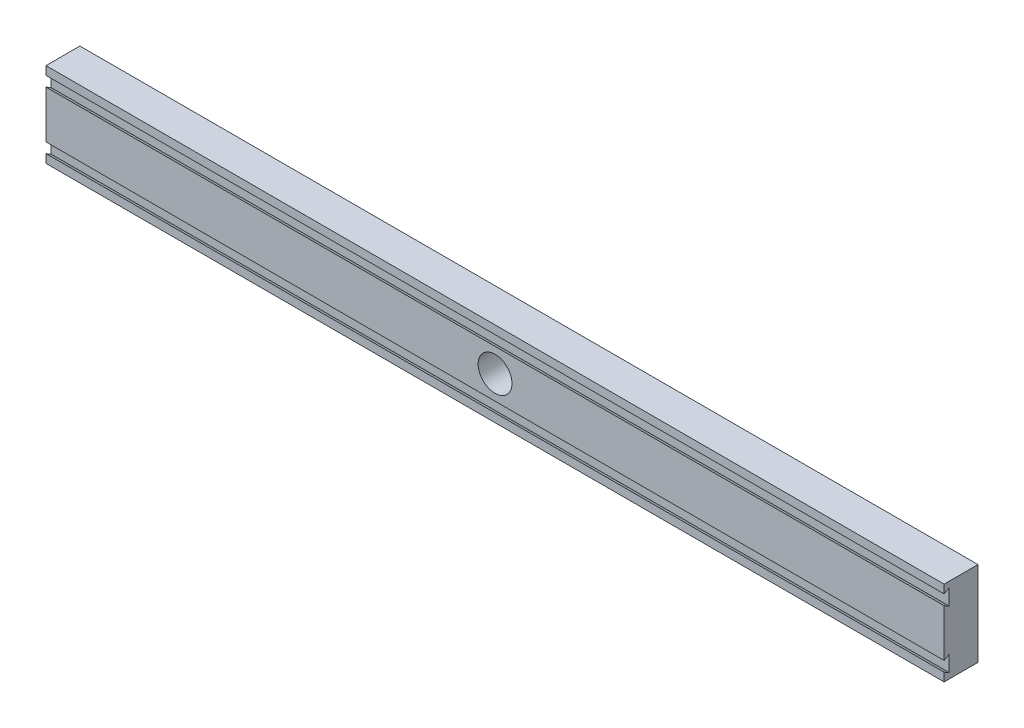
ISO-10303-21;
HEADER;
FILE_DESCRIPTION(('STEP AP214'),'2;1');
FILE_NAME('part.step','',(''),(''),'','','');
FILE_SCHEMA(('AUTOMOTIVE_DESIGN { 1 0 10303 214 1 1 1 1 }'));
ENDSEC;
DATA;
#1=APPLICATION_CONTEXT('core data for automotive mechanical design processes');
#2=APPLICATION_PROTOCOL_DEFINITION('international standard','automotive_design',2000,#1);
#3=PRODUCT_CONTEXT('',#1,'mechanical');
#4=PRODUCT('Part','Part','',(#3));
#5=PRODUCT_RELATED_PRODUCT_CATEGORY('part','',(#4));
#6=PRODUCT_DEFINITION_FORMATION('','',#4);
#7=PRODUCT_DEFINITION_CONTEXT('part definition',#1,'design');
#8=PRODUCT_DEFINITION('design','',#6,#7);
#9=PRODUCT_DEFINITION_SHAPE('','',#8);
#10=(LENGTH_UNIT() NAMED_UNIT(*) SI_UNIT(.MILLI.,.METRE.));
#11=(NAMED_UNIT(*) PLANE_ANGLE_UNIT() SI_UNIT($,.RADIAN.));
#12=(NAMED_UNIT(*) SI_UNIT($,.STERADIAN.) SOLID_ANGLE_UNIT());
#13=UNCERTAINTY_MEASURE_WITH_UNIT(LENGTH_MEASURE(1.E-05),#10,'distance_accuracy_value','');
#14=(GEOMETRIC_REPRESENTATION_CONTEXT(3) GLOBAL_UNCERTAINTY_ASSIGNED_CONTEXT((#13)) GLOBAL_UNIT_ASSIGNED_CONTEXT((#10,
#11,#12)) REPRESENTATION_CONTEXT('',''));
#15=CARTESIAN_POINT('',(0.,0.,0.));
#16=DIRECTION('',(0.,0.,1.));
#17=DIRECTION('',(1.,0.,0.));
#18=AXIS2_PLACEMENT_3D('',#15,#16,#17);
#19=CARTESIAN_POINT('',(53.106,-3.873757454592,1.90611488033737));
#20=DIRECTION('',(0.,0.866025403784436,-0.500000000000004));
#21=DIRECTION('',(0.,0.500000000000004,0.866025403784436));
#22=AXIS2_PLACEMENT_3D('',#19,#20,#21);
#23=PLANE('',#22);
#24=DIRECTION('',(0.,-0.500000000000005,-0.866025403784436));
#25=VECTOR('',#24,1.);
#26=CARTESIAN_POINT('',(-53.106,-3.873757454592,1.90611488033737));
#27=LINE('',#26,#25);
#28=CARTESIAN_POINT('',(-53.106,-4.008,1.67359997115333));
#29=VERTEX_POINT('',#28);
#30=CARTESIAN_POINT('',(-53.106,-4.35510298183681,1.07239997115333));
#31=VERTEX_POINT('',#30);
#32=EDGE_CURVE('E169',#29,#31,#27,.T.);
#33=ORIENTED_EDGE('',*,*,#32,.F.);
#34=DIRECTION('',(-1.,0.,0.));
#35=VECTOR('',#34,1.);
#36=CARTESIAN_POINT('',(53.106,-4.008,1.67359997115333));
#37=LINE('',#36,#35);
#38=CARTESIAN_POINT('',(53.106,-4.008,1.67359997115333));
#39=VERTEX_POINT('',#38);
#40=EDGE_CURVE('E11',#39,#29,#37,.T.);
#41=ORIENTED_EDGE('',*,*,#40,.F.);
#42=DIRECTION('',(0.,-0.500000000000005,-0.866025403784436));
#43=VECTOR('',#42,1.);
#44=CARTESIAN_POINT('',(53.106,-3.873757454592,1.90611488033737));
#45=LINE('',#44,#43);
#46=CARTESIAN_POINT('',(53.106,-4.35510298183681,1.07239997115333));
#47=VERTEX_POINT('',#46);
#48=EDGE_CURVE('E206',#39,#47,#45,.T.);
#49=ORIENTED_EDGE('',*,*,#48,.T.);
#50=DIRECTION('',(-1.,0.,0.));
#51=VECTOR('',#50,1.);
#52=CARTESIAN_POINT('',(53.106,-4.35510298183681,1.07239997115333));
#53=LINE('',#52,#51);
#54=EDGE_CURVE('E62',#47,#31,#53,.T.);
#55=ORIENTED_EDGE('',*,*,#54,.T.);
#56=EDGE_LOOP('',(#33,#41,#49,#55));
#57=FACE_BOUND('',#56,.T.);
#58=ADVANCED_FACE('F45',(#57),#23,.T.);
#59=CARTESIAN_POINT('',(53.106,0.,1.67359997115333));
#60=DIRECTION('',(0.,0.,1.));
#61=DIRECTION('',(1.,0.,0.));
#62=AXIS2_PLACEMENT_3D('',#59,#60,#61);
#63=PLANE('',#62);
#64=DIRECTION('',(0.,1.,0.));
#65=VECTOR('',#64,1.);
#66=CARTESIAN_POINT('',(-53.106,0.,1.67359997115333));
#67=LINE('',#66,#65);
#68=CARTESIAN_POINT('',(-53.106,-5.01,1.67359997115333));
#69=VERTEX_POINT('',#68);
#70=EDGE_CURVE('E172',#69,#29,#67,.T.);
#71=ORIENTED_EDGE('',*,*,#70,.F.);
#72=DIRECTION('',(-1.,0.,0.));
#73=VECTOR('',#72,1.);
#74=CARTESIAN_POINT('',(53.106,-5.01,1.67359997115333));
#75=LINE('',#74,#73);
#76=CARTESIAN_POINT('',(53.106,-5.01,1.67359997115333));
#77=VERTEX_POINT('',#76);
#78=EDGE_CURVE('E54',#77,#69,#75,.T.);
#79=ORIENTED_EDGE('',*,*,#78,.F.);
#80=DIRECTION('',(0.,1.,0.));
#81=VECTOR('',#80,1.);
#82=CARTESIAN_POINT('',(53.106,0.,1.67359997115333));
#83=LINE('',#82,#81);
#84=EDGE_CURVE('E159',#77,#39,#83,.T.);
#85=ORIENTED_EDGE('',*,*,#84,.T.);
#86=ORIENTED_EDGE('',*,*,#40,.T.);
#87=EDGE_LOOP('',(#71,#79,#85,#86));
#88=FACE_BOUND('',#87,.T.);
#89=ADVANCED_FACE('F247',(#88),#63,.T.);
#90=CARTESIAN_POINT('',(53.106,-5.01,-0.33040002884667));
#91=DIRECTION('',(0.,1.,0.));
#92=DIRECTION('',(0.,0.,1.));
#93=AXIS2_PLACEMENT_3D('',#90,#91,#92);
#94=PLANE('',#93);
#95=DIRECTION('',(0.,0.,-1.));
#96=VECTOR('',#95,1.);
#97=CARTESIAN_POINT('',(-53.106,-5.01,-0.33040002884667));
#98=LINE('',#97,#96);
#99=CARTESIAN_POINT('',(-53.106,-5.01,-2.33440002884667));
#100=VERTEX_POINT('',#99);
#101=EDGE_CURVE('E177',#69,#100,#98,.T.);
#102=ORIENTED_EDGE('',*,*,#101,.T.);
#103=DIRECTION('',(-1.,0.,0.));
#104=VECTOR('',#103,1.);
#105=CARTESIAN_POINT('',(53.106,-5.01,-2.33440002884667));
#106=LINE('',#105,#104);
#107=CARTESIAN_POINT('',(53.106,-5.01,-2.33440002884667));
#108=VERTEX_POINT('',#107);
#109=EDGE_CURVE('E230',#108,#100,#106,.T.);
#110=ORIENTED_EDGE('',*,*,#109,.F.);
#111=DIRECTION('',(0.,0.,-1.));
#112=VECTOR('',#111,1.);
#113=CARTESIAN_POINT('',(53.106,-5.01,-0.33040002884667));
#114=LINE('',#113,#112);
#115=EDGE_CURVE('E239',#77,#108,#114,.T.);
#116=ORIENTED_EDGE('',*,*,#115,.F.);
#117=ORIENTED_EDGE('',*,*,#78,.T.);
#118=EDGE_LOOP('',(#102,#110,#116,#117));
#119=FACE_BOUND('',#118,.T.);
#120=ADVANCED_FACE('F237',(#119),#94,.F.);
#121=CARTESIAN_POINT('',(53.106,0.,-2.33440002884667));
#122=DIRECTION('',(0.,0.,1.));
#123=DIRECTION('',(1.,0.,0.));
#124=AXIS2_PLACEMENT_3D('',#121,#122,#123);
#125=PLANE('',#124);
#126=CARTESIAN_POINT('',(0.,0.,-2.33440002884667));
#127=DIRECTION('',(0.,0.,1.));
#128=DIRECTION('',(1.,0.,0.));
#129=AXIS2_PLACEMENT_3D('',#126,#127,#128);
#130=CIRCLE('',#129,2.004);
#131=CARTESIAN_POINT('',(2.00399999999999,0.,-2.33440002884667));
#132=VERTEX_POINT('',#131);
#133=EDGE_CURVE('E173',#132,#132,#130,.T.);
#134=ORIENTED_EDGE('',*,*,#133,.T.);
#135=EDGE_LOOP('',(#134));
#136=FACE_BOUND('',#135,.T.);
#137=DIRECTION('',(0.,1.,0.));
#138=VECTOR('',#137,1.);
#139=CARTESIAN_POINT('',(-53.106,0.,-2.33440002884667));
#140=LINE('',#139,#138);
#141=CARTESIAN_POINT('',(-53.106,5.01,-2.33440002884667));
#142=VERTEX_POINT('',#141);
#143=EDGE_CURVE('E181',#100,#142,#140,.T.);
#144=ORIENTED_EDGE('',*,*,#143,.T.);
#145=DIRECTION('',(-1.,0.,0.));
#146=VECTOR('',#145,1.);
#147=CARTESIAN_POINT('',(53.106,5.01,-2.33440002884667));
#148=LINE('',#147,#146);
#149=CARTESIAN_POINT('',(53.106,5.01,-2.33440002884667));
#150=VERTEX_POINT('',#149);
#151=EDGE_CURVE('E227',#150,#142,#148,.T.);
#152=ORIENTED_EDGE('',*,*,#151,.F.);
#153=DIRECTION('',(0.,1.,0.));
#154=VECTOR('',#153,1.);
#155=CARTESIAN_POINT('',(53.106,0.,-2.33440002884667));
#156=LINE('',#155,#154);
#157=EDGE_CURVE('E296',#108,#150,#156,.T.);
#158=ORIENTED_EDGE('',*,*,#157,.F.);
#159=ORIENTED_EDGE('',*,*,#109,.T.);
#160=EDGE_LOOP('',(#144,#152,#158,#159));
#161=FACE_BOUND('',#160,.T.);
#162=ADVANCED_FACE('F267',(#136,#161),#125,.F.);
#163=CARTESIAN_POINT('',(53.106,5.01,-0.33040002884667));
#164=DIRECTION('',(0.,1.,0.));
#165=DIRECTION('',(0.,0.,1.));
#166=AXIS2_PLACEMENT_3D('',#163,#164,#165);
#167=PLANE('',#166);
#168=DIRECTION('',(0.,0.,-1.));
#169=VECTOR('',#168,1.);
#170=CARTESIAN_POINT('',(-53.106,5.01,-0.33040002884667));
#171=LINE('',#170,#169);
#172=CARTESIAN_POINT('',(-53.106,5.01,1.67359997115333));
#173=VERTEX_POINT('',#172);
#174=EDGE_CURVE('E185',#173,#142,#171,.T.);
#175=ORIENTED_EDGE('',*,*,#174,.F.);
#176=DIRECTION('',(-1.,0.,0.));
#177=VECTOR('',#176,1.);
#178=CARTESIAN_POINT('',(53.106,5.01,1.67359997115333));
#179=LINE('',#178,#177);
#180=CARTESIAN_POINT('',(53.106,5.01,1.67359997115333));
#181=VERTEX_POINT('',#180);
#182=EDGE_CURVE('E224',#181,#173,#179,.T.);
#183=ORIENTED_EDGE('',*,*,#182,.F.);
#184=DIRECTION('',(0.,0.,-1.));
#185=VECTOR('',#184,1.);
#186=CARTESIAN_POINT('',(53.106,5.01,-0.33040002884667));
#187=LINE('',#186,#185);
#188=EDGE_CURVE('E299',#181,#150,#187,.T.);
#189=ORIENTED_EDGE('',*,*,#188,.T.);
#190=ORIENTED_EDGE('',*,*,#151,.T.);
#191=EDGE_LOOP('',(#175,#183,#189,#190));
#192=FACE_BOUND('',#191,.T.);
#193=ADVANCED_FACE('F271',(#192),#167,.T.);
#194=CARTESIAN_POINT('',(-53.106,4.008,1.67359997115333));
#195=VERTEX_POINT('',#194);
#196=EDGE_CURVE('E178',#195,#173,#67,.T.);
#197=ORIENTED_EDGE('',*,*,#196,.F.);
#198=DIRECTION('',(-1.,0.,0.));
#199=VECTOR('',#198,1.);
#200=CARTESIAN_POINT('',(53.106,4.008,1.67359997115333));
#201=LINE('',#200,#199);
#202=CARTESIAN_POINT('',(53.106,4.008,1.67359997115333));
#203=VERTEX_POINT('',#202);
#204=EDGE_CURVE('E221',#203,#195,#201,.T.);
#205=ORIENTED_EDGE('',*,*,#204,.F.);
#206=EDGE_CURVE('E158',#203,#181,#83,.T.);
#207=ORIENTED_EDGE('',*,*,#206,.T.);
#208=ORIENTED_EDGE('',*,*,#182,.T.);
#209=EDGE_LOOP('',(#197,#205,#207,#208));
#210=FACE_BOUND('',#209,.T.);
#211=ADVANCED_FACE('F263',(#210),#63,.T.);
#212=CARTESIAN_POINT('',(53.106,3.873757454592,1.90611488033737));
#213=DIRECTION('',(0.,0.866025403784436,0.500000000000004));
#214=DIRECTION('',(0.,-0.500000000000004,0.866025403784436));
#215=AXIS2_PLACEMENT_3D('',#212,#213,#214);
#216=PLANE('',#215);
#217=DIRECTION('',(0.,0.500000000000005,-0.866025403784436));
#218=VECTOR('',#217,1.);
#219=CARTESIAN_POINT('',(-53.106,3.873757454592,1.90611488033737));
#220=LINE('',#219,#218);
#221=CARTESIAN_POINT('',(-53.106,4.35510298183681,1.07239997115333));
#222=VERTEX_POINT('',#221);
#223=EDGE_CURVE('E189',#195,#222,#220,.T.);
#224=ORIENTED_EDGE('',*,*,#223,.T.);
#225=DIRECTION('',(-1.,0.,0.));
#226=VECTOR('',#225,1.);
#227=CARTESIAN_POINT('',(53.106,4.35510298183681,1.07239997115333));
#228=LINE('',#227,#226);
#229=CARTESIAN_POINT('',(53.106,4.35510298183681,1.07239997115333));
#230=VERTEX_POINT('',#229);
#231=EDGE_CURVE('E217',#230,#222,#228,.T.);
#232=ORIENTED_EDGE('',*,*,#231,.F.);
#233=DIRECTION('',(0.,0.500000000000005,-0.866025403784436));
#234=VECTOR('',#233,1.);
#235=CARTESIAN_POINT('',(53.106,3.873757454592,1.90611488033737));
#236=LINE('',#235,#234);
#237=EDGE_CURVE('E303',#203,#230,#236,.T.);
#238=ORIENTED_EDGE('',*,*,#237,.F.);
#239=ORIENTED_EDGE('',*,*,#204,.T.);
#240=EDGE_LOOP('',(#224,#232,#238,#239));
#241=FACE_BOUND('',#240,.T.);
#242=ADVANCED_FACE('F270',(#241),#216,.F.);
#243=CARTESIAN_POINT('',(53.106,0.,1.07239997115333));
#244=DIRECTION('',(0.,0.,-1.));
#245=DIRECTION('',(-1.,0.,0.));
#246=AXIS2_PLACEMENT_3D('',#243,#244,#245);
#247=PLANE('',#246);
#248=DIRECTION('',(0.,-1.,0.));
#249=VECTOR('',#248,1.);
#250=CARTESIAN_POINT('',(-53.106,0.,1.07239997115333));
#251=LINE('',#250,#249);
#252=CARTESIAN_POINT('',(-53.106,2.45849701816319,1.07239997115333));
#253=VERTEX_POINT('',#252);
#254=EDGE_CURVE('E192',#222,#253,#251,.T.);
#255=ORIENTED_EDGE('',*,*,#254,.T.);
#256=DIRECTION('',(-1.,0.,0.));
#257=VECTOR('',#256,1.);
#258=CARTESIAN_POINT('',(53.106,2.45849701816319,1.07239997115333));
#259=LINE('',#258,#257);
#260=CARTESIAN_POINT('',(53.106,2.45849701816319,1.07239997115333));
#261=VERTEX_POINT('',#260);
#262=EDGE_CURVE('E213',#261,#253,#259,.T.);
#263=ORIENTED_EDGE('',*,*,#262,.F.);
#264=DIRECTION('',(0.,-1.,0.));
#265=VECTOR('',#264,1.);
#266=CARTESIAN_POINT('',(53.106,0.,1.07239997115333));
#267=LINE('',#266,#265);
#268=EDGE_CURVE('E305',#230,#261,#267,.T.);
#269=ORIENTED_EDGE('',*,*,#268,.F.);
#270=ORIENTED_EDGE('',*,*,#231,.T.);
#271=EDGE_LOOP('',(#255,#263,#269,#270));
#272=FACE_BOUND('',#271,.T.);
#273=ADVANCED_FACE('F279',(#272),#247,.F.);
#274=CARTESIAN_POINT('',(53.106,1.23644254540798,-1.04426046527548));
#275=DIRECTION('',(0.,-0.866025403784437,0.500000000000003));
#276=DIRECTION('',(0.,-0.500000000000003,-0.866025403784437));
#277=AXIS2_PLACEMENT_3D('',#274,#275,#276);
#278=PLANE('',#277);
#279=DIRECTION('',(0.,0.500000000000003,0.866025403784437));
#280=VECTOR('',#279,1.);
#281=CARTESIAN_POINT('',(-53.106,1.23644254540798,-1.04426046527548));
#282=LINE('',#281,#280);
#283=CARTESIAN_POINT('',(-53.106,2.8056,1.67359997115333));
#284=VERTEX_POINT('',#283);
#285=EDGE_CURVE('E195',#253,#284,#282,.T.);
#286=ORIENTED_EDGE('',*,*,#285,.T.);
#287=DIRECTION('',(-1.,0.,0.));
#288=VECTOR('',#287,1.);
#289=CARTESIAN_POINT('',(53.106,2.8056,1.67359997115333));
#290=LINE('',#289,#288);
#291=CARTESIAN_POINT('',(53.106,2.8056,1.67359997115333));
#292=VERTEX_POINT('',#291);
#293=EDGE_CURVE('E146',#292,#284,#290,.T.);
#294=ORIENTED_EDGE('',*,*,#293,.F.);
#295=DIRECTION('',(0.,0.500000000000003,0.866025403784437));
#296=VECTOR('',#295,1.);
#297=CARTESIAN_POINT('',(53.106,1.23644254540798,-1.04426046527548));
#298=LINE('',#297,#296);
#299=EDGE_CURVE('E154',#261,#292,#298,.T.);
#300=ORIENTED_EDGE('',*,*,#299,.F.);
#301=ORIENTED_EDGE('',*,*,#262,.T.);
#302=EDGE_LOOP('',(#286,#294,#300,#301));
#303=FACE_BOUND('',#302,.T.);
#304=ADVANCED_FACE('F274',(#303),#278,.F.);
#305=CARTESIAN_POINT('',(0.,0.,1.67359997115333));
#306=DIRECTION('',(0.,0.,1.));
#307=DIRECTION('',(1.,0.,0.));
#308=AXIS2_PLACEMENT_3D('',#305,#306,#307);
#309=CIRCLE('',#308,2.004);
#310=CARTESIAN_POINT('',(2.00399999999999,0.,1.67359997115333));
#311=VERTEX_POINT('',#310);
#312=EDGE_CURVE('E283',#311,#311,#309,.T.);
#313=ORIENTED_EDGE('',*,*,#312,.F.);
#314=EDGE_LOOP('',(#313));
#315=FACE_BOUND('',#314,.T.);
#316=CARTESIAN_POINT('',(-53.106,-2.8056,1.67359997115333));
#317=VERTEX_POINT('',#316);
#318=EDGE_CURVE('E141',#317,#284,#67,.T.);
#319=ORIENTED_EDGE('',*,*,#318,.F.);
#320=DIRECTION('',(-1.,0.,0.));
#321=VECTOR('',#320,1.);
#322=CARTESIAN_POINT('',(53.106,-2.8056,1.67359997115333));
#323=LINE('',#322,#321);
#324=CARTESIAN_POINT('',(53.106,-2.8056,1.67359997115333));
#325=VERTEX_POINT('',#324);
#326=EDGE_CURVE('E136',#325,#317,#323,.T.);
#327=ORIENTED_EDGE('',*,*,#326,.F.);
#328=EDGE_CURVE('E139',#325,#292,#83,.T.);
#329=ORIENTED_EDGE('',*,*,#328,.T.);
#330=ORIENTED_EDGE('',*,*,#293,.T.);
#331=EDGE_LOOP('',(#319,#327,#329,#330));
#332=FACE_BOUND('',#331,.T.);
#333=ADVANCED_FACE('F138',(#315,#332),#63,.T.);
#334=CARTESIAN_POINT('',(53.106,-1.23644254540798,-1.04426046527548));
#335=DIRECTION('',(0.,-0.866025403784437,-0.500000000000003));
#336=DIRECTION('',(0.,0.500000000000003,-0.866025403784437));
#337=AXIS2_PLACEMENT_3D('',#334,#335,#336);
#338=PLANE('',#337);
#339=DIRECTION('',(0.,-0.500000000000003,0.866025403784437));
#340=VECTOR('',#339,1.);
#341=CARTESIAN_POINT('',(-53.106,-1.23644254540798,-1.04426046527548));
#342=LINE('',#341,#340);
#343=CARTESIAN_POINT('',(-53.106,-2.45849701816319,1.07239997115333));
#344=VERTEX_POINT('',#343);
#345=EDGE_CURVE('E199',#344,#317,#342,.T.);
#346=ORIENTED_EDGE('',*,*,#345,.F.);
#347=DIRECTION('',(-1.,0.,0.));
#348=VECTOR('',#347,1.);
#349=CARTESIAN_POINT('',(53.106,-2.45849701816319,1.07239997115333));
#350=LINE('',#349,#348);
#351=CARTESIAN_POINT('',(53.106,-2.45849701816319,1.07239997115333));
#352=VERTEX_POINT('',#351);
#353=EDGE_CURVE('E99',#352,#344,#350,.T.);
#354=ORIENTED_EDGE('',*,*,#353,.F.);
#355=DIRECTION('',(0.,-0.500000000000003,0.866025403784437));
#356=VECTOR('',#355,1.);
#357=CARTESIAN_POINT('',(53.106,-1.23644254540798,-1.04426046527548));
#358=LINE('',#357,#356);
#359=EDGE_CURVE('E152',#352,#325,#358,.T.);
#360=ORIENTED_EDGE('',*,*,#359,.T.);
#361=ORIENTED_EDGE('',*,*,#326,.T.);
#362=EDGE_LOOP('',(#346,#354,#360,#361));
#363=FACE_BOUND('',#362,.T.);
#364=ADVANCED_FACE('F160',(#363),#338,.T.);
#365=CARTESIAN_POINT('',(53.106,0.,1.07239997115333));
#366=DIRECTION('',(0.,0.,1.));
#367=DIRECTION('',(1.,0.,0.));
#368=AXIS2_PLACEMENT_3D('',#365,#366,#367);
#369=PLANE('',#368);
#370=DIRECTION('',(0.,1.,0.));
#371=VECTOR('',#370,1.);
#372=CARTESIAN_POINT('',(-53.106,0.,1.07239997115333));
#373=LINE('',#372,#371);
#374=EDGE_CURVE('E202',#31,#344,#373,.T.);
#375=ORIENTED_EDGE('',*,*,#374,.F.);
#376=ORIENTED_EDGE('',*,*,#54,.F.);
#377=DIRECTION('',(0.,1.,0.));
#378=VECTOR('',#377,1.);
#379=CARTESIAN_POINT('',(53.106,0.,1.07239997115333));
#380=LINE('',#379,#378);
#381=EDGE_CURVE('E162',#47,#352,#380,.T.);
#382=ORIENTED_EDGE('',*,*,#381,.T.);
#383=ORIENTED_EDGE('',*,*,#353,.T.);
#384=EDGE_LOOP('',(#375,#376,#382,#383));
#385=FACE_BOUND('',#384,.T.);
#386=ADVANCED_FACE('F248',(#385),#369,.T.);
#387=CARTESIAN_POINT('',(53.106,0.,-0.33040002884667));
#388=DIRECTION('',(1.,0.,0.));
#389=DIRECTION('',(0.,0.,-1.));
#390=AXIS2_PLACEMENT_3D('',#387,#388,#389);
#391=PLANE('',#390);
#392=ORIENTED_EDGE('',*,*,#48,.F.);
#393=ORIENTED_EDGE('',*,*,#84,.F.);
#394=ORIENTED_EDGE('',*,*,#115,.T.);
#395=ORIENTED_EDGE('',*,*,#157,.T.);
#396=ORIENTED_EDGE('',*,*,#188,.F.);
#397=ORIENTED_EDGE('',*,*,#206,.F.);
#398=ORIENTED_EDGE('',*,*,#237,.T.);
#399=ORIENTED_EDGE('',*,*,#268,.T.);
#400=ORIENTED_EDGE('',*,*,#299,.T.);
#401=ORIENTED_EDGE('',*,*,#328,.F.);
#402=ORIENTED_EDGE('',*,*,#359,.F.);
#403=ORIENTED_EDGE('',*,*,#381,.F.);
#404=EDGE_LOOP('',(#392,#393,#394,#395,#396,#397,#398,#399,#400,#401,#402,#403));
#405=FACE_BOUND('',#404,.T.);
#406=ADVANCED_FACE('F150',(#405),#391,.T.);
#407=CARTESIAN_POINT('',(-53.106,0.,-0.33040002884667));
#408=DIRECTION('',(1.,0.,0.));
#409=DIRECTION('',(0.,0.,-1.));
#410=AXIS2_PLACEMENT_3D('',#407,#408,#409);
#411=PLANE('',#410);
#412=ORIENTED_EDGE('',*,*,#32,.T.);
#413=ORIENTED_EDGE('',*,*,#374,.T.);
#414=ORIENTED_EDGE('',*,*,#345,.T.);
#415=ORIENTED_EDGE('',*,*,#318,.T.);
#416=ORIENTED_EDGE('',*,*,#285,.F.);
#417=ORIENTED_EDGE('',*,*,#254,.F.);
#418=ORIENTED_EDGE('',*,*,#223,.F.);
#419=ORIENTED_EDGE('',*,*,#196,.T.);
#420=ORIENTED_EDGE('',*,*,#174,.T.);
#421=ORIENTED_EDGE('',*,*,#143,.F.);
#422=ORIENTED_EDGE('',*,*,#101,.F.);
#423=ORIENTED_EDGE('',*,*,#70,.T.);
#424=EDGE_LOOP('',(#412,#413,#414,#415,#416,#417,#418,#419,#420,#421,#422,#423));
#425=FACE_BOUND('',#424,.T.);
#426=ADVANCED_FACE('F246',(#425),#411,.F.);
#427=CARTESIAN_POINT('',(0.,0.,-2.33440002884667));
#428=DIRECTION('',(0.,0.,1.));
#429=DIRECTION('',(1.,0.,0.));
#430=AXIS2_PLACEMENT_3D('',#427,#428,#429);
#431=CYLINDRICAL_SURFACE('',#430,2.004);
#432=ORIENTED_EDGE('',*,*,#133,.F.);
#433=EDGE_LOOP('',(#432));
#434=FACE_BOUND('',#433,.T.);
#435=ORIENTED_EDGE('',*,*,#312,.T.);
#436=EDGE_LOOP('',(#435));
#437=FACE_BOUND('',#436,.T.);
#438=ADVANCED_FACE('F383',(#434,#437),#431,.F.);
#439=CLOSED_SHELL('',(#58,#89,#120,#162,#193,#211,#242,#273,#304,#333,#364,#386,#406,#426,#438));
#440=MANIFOLD_SOLID_BREP('B2',#439);
#441=ADVANCED_BREP_SHAPE_REPRESENTATION('',(#18,#440),#14);
#442=SHAPE_DEFINITION_REPRESENTATION(#9,#441);
ENDSEC;
END-ISO-10303-21;
